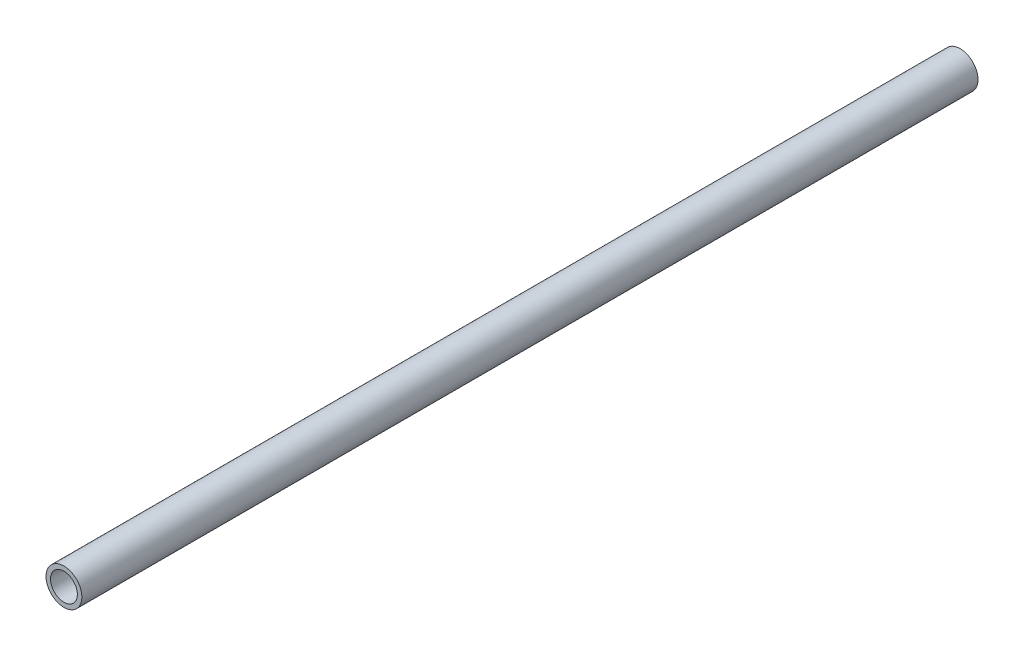
ISO-10303-21;
HEADER;
FILE_DESCRIPTION(('STEP AP214'),'2;1');
FILE_NAME('part.step','',(''),(''),'','','');
FILE_SCHEMA(('AUTOMOTIVE_DESIGN { 1 0 10303 214 1 1 1 1 }'));
ENDSEC;
DATA;
#1=APPLICATION_CONTEXT('core data for automotive mechanical design processes');
#2=APPLICATION_PROTOCOL_DEFINITION('international standard','automotive_design',2000,#1);
#3=PRODUCT_CONTEXT('',#1,'mechanical');
#4=PRODUCT('Part','Part','',(#3));
#5=PRODUCT_RELATED_PRODUCT_CATEGORY('part','',(#4));
#6=PRODUCT_DEFINITION_FORMATION('','',#4);
#7=PRODUCT_DEFINITION_CONTEXT('part definition',#1,'design');
#8=PRODUCT_DEFINITION('design','',#6,#7);
#9=PRODUCT_DEFINITION_SHAPE('','',#8);
#10=(LENGTH_UNIT() NAMED_UNIT(*) SI_UNIT(.MILLI.,.METRE.));
#11=(NAMED_UNIT(*) PLANE_ANGLE_UNIT() SI_UNIT($,.RADIAN.));
#12=(NAMED_UNIT(*) SI_UNIT($,.STERADIAN.) SOLID_ANGLE_UNIT());
#13=UNCERTAINTY_MEASURE_WITH_UNIT(LENGTH_MEASURE(1.E-05),#10,'distance_accuracy_value','');
#14=(GEOMETRIC_REPRESENTATION_CONTEXT(3) GLOBAL_UNCERTAINTY_ASSIGNED_CONTEXT((#13)) GLOBAL_UNIT_ASSIGNED_CONTEXT((#10,
#11,#12)) REPRESENTATION_CONTEXT('',''));
#15=CARTESIAN_POINT('',(0.,0.,0.));
#16=DIRECTION('',(0.,0.,1.));
#17=DIRECTION('',(1.,0.,0.));
#18=AXIS2_PLACEMENT_3D('',#15,#16,#17);
#19=CARTESIAN_POINT('',(0.,0.,635.));
#20=DIRECTION('',(0.,0.,1.));
#21=DIRECTION('',(1.,0.,0.));
#22=AXIS2_PLACEMENT_3D('',#19,#20,#21);
#23=PLANE('',#22);
#24=CARTESIAN_POINT('',(0.,0.,635.));
#25=DIRECTION('',(0.,0.,1.));
#26=DIRECTION('',(1.,0.,0.));
#27=AXIS2_PLACEMENT_3D('',#24,#25,#26);
#28=CIRCLE('',#27,12.7);
#29=CARTESIAN_POINT('',(-12.7,0.,635.));
#30=VERTEX_POINT('',#29);
#31=EDGE_CURVE('E10',#30,#30,#28,.T.);
#32=ORIENTED_EDGE('',*,*,#31,.T.);
#33=EDGE_LOOP('',(#32));
#34=FACE_BOUND('',#33,.T.);
#35=CARTESIAN_POINT('',(0.,0.,635.));
#36=DIRECTION('',(0.,0.,1.));
#37=DIRECTION('',(1.,0.,0.));
#38=AXIS2_PLACEMENT_3D('',#35,#36,#37);
#39=CIRCLE('',#38,9.525);
#40=CARTESIAN_POINT('',(-9.525,0.,635.));
#41=VERTEX_POINT('',#40);
#42=EDGE_CURVE('E50',#41,#41,#39,.T.);
#43=ORIENTED_EDGE('',*,*,#42,.F.);
#44=EDGE_LOOP('',(#43));
#45=FACE_BOUND('',#44,.T.);
#46=ADVANCED_FACE('F37',(#34,#45),#23,.T.);
#47=CARTESIAN_POINT('',(0.,0.,0.));
#48=DIRECTION('',(0.,0.,1.));
#49=DIRECTION('',(1.,0.,0.));
#50=AXIS2_PLACEMENT_3D('',#47,#48,#49);
#51=PLANE('',#50);
#52=CARTESIAN_POINT('',(0.,0.,0.));
#53=DIRECTION('',(0.,0.,1.));
#54=DIRECTION('',(1.,0.,0.));
#55=AXIS2_PLACEMENT_3D('',#52,#53,#54);
#56=CIRCLE('',#55,12.7);
#57=CARTESIAN_POINT('',(-12.7,0.,-1.11022302462516E-13));
#58=VERTEX_POINT('',#57);
#59=EDGE_CURVE('E41',#58,#58,#56,.T.);
#60=ORIENTED_EDGE('',*,*,#59,.F.);
#61=EDGE_LOOP('',(#60));
#62=FACE_BOUND('',#61,.T.);
#63=CARTESIAN_POINT('',(0.,0.,0.));
#64=DIRECTION('',(0.,0.,1.));
#65=DIRECTION('',(1.,0.,0.));
#66=AXIS2_PLACEMENT_3D('',#63,#64,#65);
#67=CIRCLE('',#66,9.525);
#68=CARTESIAN_POINT('',(-9.525,0.,-1.11022302462516E-13));
#69=VERTEX_POINT('',#68);
#70=EDGE_CURVE('E52',#69,#69,#67,.T.);
#71=ORIENTED_EDGE('',*,*,#70,.T.);
#72=EDGE_LOOP('',(#71));
#73=FACE_BOUND('',#72,.T.);
#74=ADVANCED_FACE('F64',(#62,#73),#51,.F.);
#75=CARTESIAN_POINT('',(0.,0.,635.));
#76=DIRECTION('',(0.,0.,-1.));
#77=DIRECTION('',(-1.,0.,0.));
#78=AXIS2_PLACEMENT_3D('',#75,#76,#77);
#79=CYLINDRICAL_SURFACE('',#78,12.7);
#80=CARTESIAN_POINT('',(-12.7,0.,635.));
#81=CARTESIAN_POINT('',(-12.7,0.,628.385416666667));
#82=CARTESIAN_POINT('',(-12.7,0.,621.770833333333));
#83=CARTESIAN_POINT('',(-12.7,0.,608.541666666667));
#84=CARTESIAN_POINT('',(-12.7,0.,601.927083333333));
#85=CARTESIAN_POINT('',(-12.7,0.,588.697916666667));
#86=CARTESIAN_POINT('',(-12.7,0.,582.083333333333));
#87=CARTESIAN_POINT('',(-12.7,0.,568.854166666667));
#88=CARTESIAN_POINT('',(-12.7,0.,562.239583333333));
#89=CARTESIAN_POINT('',(-12.7,0.,549.010416666667));
#90=CARTESIAN_POINT('',(-12.7,0.,542.395833333333));
#91=CARTESIAN_POINT('',(-12.7,0.,529.166666666667));
#92=CARTESIAN_POINT('',(-12.7,0.,522.552083333333));
#93=CARTESIAN_POINT('',(-12.7,0.,509.322916666667));
#94=CARTESIAN_POINT('',(-12.7,0.,502.708333333333));
#95=CARTESIAN_POINT('',(-12.7,0.,489.479166666667));
#96=CARTESIAN_POINT('',(-12.7,0.,482.864583333333));
#97=CARTESIAN_POINT('',(-12.7,0.,469.635416666667));
#98=CARTESIAN_POINT('',(-12.7,0.,463.020833333333));
#99=CARTESIAN_POINT('',(-12.7,0.,449.791666666667));
#100=CARTESIAN_POINT('',(-12.7,0.,443.177083333333));
#101=CARTESIAN_POINT('',(-12.7,0.,429.947916666667));
#102=CARTESIAN_POINT('',(-12.7,0.,423.333333333333));
#103=CARTESIAN_POINT('',(-12.7,0.,410.104166666667));
#104=CARTESIAN_POINT('',(-12.7,0.,403.489583333333));
#105=CARTESIAN_POINT('',(-12.7,0.,390.260416666667));
#106=CARTESIAN_POINT('',(-12.7,0.,383.645833333333));
#107=CARTESIAN_POINT('',(-12.7,0.,370.416666666667));
#108=CARTESIAN_POINT('',(-12.7,0.,363.802083333333));
#109=CARTESIAN_POINT('',(-12.7,0.,350.572916666667));
#110=CARTESIAN_POINT('',(-12.7,0.,343.958333333333));
#111=CARTESIAN_POINT('',(-12.7,0.,330.729166666667));
#112=CARTESIAN_POINT('',(-12.7,0.,324.114583333333));
#113=CARTESIAN_POINT('',(-12.7,0.,310.885416666667));
#114=CARTESIAN_POINT('',(-12.7,0.,304.270833333333));
#115=CARTESIAN_POINT('',(-12.7,0.,291.041666666667));
#116=CARTESIAN_POINT('',(-12.7,0.,284.427083333333));
#117=CARTESIAN_POINT('',(-12.7,0.,271.197916666667));
#118=CARTESIAN_POINT('',(-12.7,0.,264.583333333333));
#119=CARTESIAN_POINT('',(-12.7,0.,251.354166666667));
#120=CARTESIAN_POINT('',(-12.7,0.,244.739583333333));
#121=CARTESIAN_POINT('',(-12.7,0.,231.510416666667));
#122=CARTESIAN_POINT('',(-12.7,0.,224.895833333333));
#123=CARTESIAN_POINT('',(-12.7,0.,211.666666666667));
#124=CARTESIAN_POINT('',(-12.7,0.,205.052083333333));
#125=CARTESIAN_POINT('',(-12.7,0.,191.822916666667));
#126=CARTESIAN_POINT('',(-12.7,0.,185.208333333333));
#127=CARTESIAN_POINT('',(-12.7,0.,171.979166666667));
#128=CARTESIAN_POINT('',(-12.7,0.,165.364583333333));
#129=CARTESIAN_POINT('',(-12.7,0.,152.135416666667));
#130=CARTESIAN_POINT('',(-12.7,0.,145.520833333333));
#131=CARTESIAN_POINT('',(-12.7,0.,132.291666666667));
#132=CARTESIAN_POINT('',(-12.7,0.,125.677083333333));
#133=CARTESIAN_POINT('',(-12.7,0.,112.447916666667));
#134=CARTESIAN_POINT('',(-12.7,0.,105.833333333333));
#135=CARTESIAN_POINT('',(-12.7,0.,92.6041666666666));
#136=CARTESIAN_POINT('',(-12.7,0.,85.9895833333332));
#137=CARTESIAN_POINT('',(-12.7,0.,72.7604166666665));
#138=CARTESIAN_POINT('',(-12.7,0.,66.1458333333332));
#139=CARTESIAN_POINT('',(-12.7,0.,52.9166666666666));
#140=CARTESIAN_POINT('',(-12.7,0.,46.3020833333332));
#141=CARTESIAN_POINT('',(-12.7,0.,33.0729166666666));
#142=CARTESIAN_POINT('',(-12.7,0.,26.4583333333333));
#143=CARTESIAN_POINT('',(-12.7,0.,13.2291666666666));
#144=CARTESIAN_POINT('',(-12.7,0.,6.61458333333324));
#145=CARTESIAN_POINT('',(-12.7,0.,-1.11022302462516E-13));
#146=B_SPLINE_CURVE_WITH_KNOTS('',3,(#80,#81,#82,#83,#84,#85,#86,#87,#88,#89,#90,#91,#92,#93,
#94,#95,#96,#97,#98,#99,#100,#101,#102,#103,#104,#105,#106,#107,#108,#109,#110,#111,#112,#113,
#114,#115,#116,#117,#118,#119,#120,#121,#122,#123,#124,#125,#126,#127,#128,#129,#130,#131,#132,
#133,#134,#135,#136,#137,#138,#139,#140,#141,#142,#143,#144,#145),.UNSPECIFIED.,.F.,.F.,(4,2,2,
2,2,2,2,2,2,2,2,2,2,2,2,2,2,2,2,2,2,2,2,2,2,2,2,2,2,2,2,2,4),(0.,19.8437499999999,39.6875,
59.5312499999999,79.375,99.2187499999999,119.0625,138.90625,158.75,178.59375,198.4375,218.28125,
238.125,257.96875,277.8125,297.65625,317.5,337.34375,357.1875,377.03125,396.875,416.71875,
436.5625,456.40625,476.25,496.09375,515.9375,535.78125,555.625,575.46875,595.3125,615.15625,
635.),.UNSPECIFIED.);
#147=EDGE_CURVE('BSEAM39',#30,#58,#146,.T.);
#148=ORIENTED_EDGE('',*,*,#31,.F.);
#149=ORIENTED_EDGE('',*,*,#59,.T.);
#150=ORIENTED_EDGE('',*,*,#147,.T.);
#151=ORIENTED_EDGE('',*,*,#147,.F.);
#152=EDGE_LOOP('',(#148,#150,#149,#151));
#153=FACE_BOUND('',#152,.T.);
#154=ADVANCED_FACE('F39',(#153),#79,.T.);
#155=CARTESIAN_POINT('',(0.,0.,635.));
#156=DIRECTION('',(0.,0.,-1.));
#157=DIRECTION('',(-1.,0.,0.));
#158=AXIS2_PLACEMENT_3D('',#155,#156,#157);
#159=CYLINDRICAL_SURFACE('',#158,9.525);
#160=CARTESIAN_POINT('',(-9.525,0.,635.));
#161=CARTESIAN_POINT('',(-9.525,0.,628.385416666667));
#162=CARTESIAN_POINT('',(-9.525,0.,621.770833333333));
#163=CARTESIAN_POINT('',(-9.525,0.,608.541666666667));
#164=CARTESIAN_POINT('',(-9.525,0.,601.927083333333));
#165=CARTESIAN_POINT('',(-9.525,0.,588.697916666667));
#166=CARTESIAN_POINT('',(-9.525,0.,582.083333333333));
#167=CARTESIAN_POINT('',(-9.525,0.,568.854166666667));
#168=CARTESIAN_POINT('',(-9.525,0.,562.239583333333));
#169=CARTESIAN_POINT('',(-9.525,0.,549.010416666667));
#170=CARTESIAN_POINT('',(-9.525,0.,542.395833333333));
#171=CARTESIAN_POINT('',(-9.525,0.,529.166666666667));
#172=CARTESIAN_POINT('',(-9.525,0.,522.552083333333));
#173=CARTESIAN_POINT('',(-9.525,0.,509.322916666667));
#174=CARTESIAN_POINT('',(-9.525,0.,502.708333333333));
#175=CARTESIAN_POINT('',(-9.525,0.,489.479166666667));
#176=CARTESIAN_POINT('',(-9.525,0.,482.864583333333));
#177=CARTESIAN_POINT('',(-9.525,0.,469.635416666667));
#178=CARTESIAN_POINT('',(-9.525,0.,463.020833333333));
#179=CARTESIAN_POINT('',(-9.525,0.,449.791666666667));
#180=CARTESIAN_POINT('',(-9.525,0.,443.177083333333));
#181=CARTESIAN_POINT('',(-9.525,0.,429.947916666667));
#182=CARTESIAN_POINT('',(-9.525,0.,423.333333333333));
#183=CARTESIAN_POINT('',(-9.525,0.,410.104166666667));
#184=CARTESIAN_POINT('',(-9.525,0.,403.489583333333));
#185=CARTESIAN_POINT('',(-9.525,0.,390.260416666667));
#186=CARTESIAN_POINT('',(-9.525,0.,383.645833333333));
#187=CARTESIAN_POINT('',(-9.525,0.,370.416666666667));
#188=CARTESIAN_POINT('',(-9.525,0.,363.802083333333));
#189=CARTESIAN_POINT('',(-9.525,0.,350.572916666667));
#190=CARTESIAN_POINT('',(-9.525,0.,343.958333333333));
#191=CARTESIAN_POINT('',(-9.525,0.,330.729166666667));
#192=CARTESIAN_POINT('',(-9.525,0.,324.114583333333));
#193=CARTESIAN_POINT('',(-9.525,0.,310.885416666667));
#194=CARTESIAN_POINT('',(-9.525,0.,304.270833333333));
#195=CARTESIAN_POINT('',(-9.525,0.,291.041666666667));
#196=CARTESIAN_POINT('',(-9.525,0.,284.427083333333));
#197=CARTESIAN_POINT('',(-9.525,0.,271.197916666667));
#198=CARTESIAN_POINT('',(-9.525,0.,264.583333333333));
#199=CARTESIAN_POINT('',(-9.525,0.,251.354166666667));
#200=CARTESIAN_POINT('',(-9.525,0.,244.739583333333));
#201=CARTESIAN_POINT('',(-9.525,0.,231.510416666667));
#202=CARTESIAN_POINT('',(-9.525,0.,224.895833333333));
#203=CARTESIAN_POINT('',(-9.525,0.,211.666666666667));
#204=CARTESIAN_POINT('',(-9.525,0.,205.052083333333));
#205=CARTESIAN_POINT('',(-9.525,0.,191.822916666666));
#206=CARTESIAN_POINT('',(-9.525,0.,185.208333333333));
#207=CARTESIAN_POINT('',(-9.525,0.,171.979166666666));
#208=CARTESIAN_POINT('',(-9.525,0.,165.364583333333));
#209=CARTESIAN_POINT('',(-9.525,0.,152.135416666666));
#210=CARTESIAN_POINT('',(-9.525,0.,145.520833333333));
#211=CARTESIAN_POINT('',(-9.525,0.,132.291666666667));
#212=CARTESIAN_POINT('',(-9.525,0.,125.677083333333));
#213=CARTESIAN_POINT('',(-9.525,0.,112.447916666667));
#214=CARTESIAN_POINT('',(-9.525,0.,105.833333333333));
#215=CARTESIAN_POINT('',(-9.525,0.,92.6041666666666));
#216=CARTESIAN_POINT('',(-9.525,0.,85.9895833333332));
#217=CARTESIAN_POINT('',(-9.525,0.,72.7604166666665));
#218=CARTESIAN_POINT('',(-9.525,0.,66.1458333333332));
#219=CARTESIAN_POINT('',(-9.525,0.,52.9166666666666));
#220=CARTESIAN_POINT('',(-9.525,0.,46.3020833333332));
#221=CARTESIAN_POINT('',(-9.525,0.,33.0729166666666));
#222=CARTESIAN_POINT('',(-9.525,0.,26.4583333333333));
#223=CARTESIAN_POINT('',(-9.525,0.,13.2291666666666));
#224=CARTESIAN_POINT('',(-9.525,0.,6.61458333333324));
#225=CARTESIAN_POINT('',(-9.525,0.,-1.11022302462516E-13));
#226=B_SPLINE_CURVE_WITH_KNOTS('',3,(#160,#161,#162,#163,#164,#165,#166,#167,#168,#169,#170,
#171,#172,#173,#174,#175,#176,#177,#178,#179,#180,#181,#182,#183,#184,#185,#186,#187,#188,#189,
#190,#191,#192,#193,#194,#195,#196,#197,#198,#199,#200,#201,#202,#203,#204,#205,#206,#207,#208,
#209,#210,#211,#212,#213,#214,#215,#216,#217,#218,#219,#220,#221,#222,#223,#224,#225),
.UNSPECIFIED.,.F.,.F.,(4,2,2,2,2,2,2,2,2,2,2,2,2,2,2,2,2,2,2,2,2,2,2,2,2,2,2,2,2,2,2,2,4),(0.,
19.84375,39.6875000000001,59.53125,79.3750000000001,99.2187500000001,119.0625,138.90625,158.75,
178.59375,198.4375,218.28125,238.125,257.96875,277.8125,297.65625,317.5,337.34375,357.1875,
377.03125,396.875,416.71875,436.5625,456.40625,476.25,496.09375,515.9375,535.78125,555.625,
575.46875,595.3125,615.15625,635.),.UNSPECIFIED.);
#227=EDGE_CURVE('BSEAM60',#41,#69,#226,.T.);
#228=ORIENTED_EDGE('',*,*,#42,.T.);
#229=ORIENTED_EDGE('',*,*,#70,.F.);
#230=ORIENTED_EDGE('',*,*,#227,.T.);
#231=ORIENTED_EDGE('',*,*,#227,.F.);
#232=EDGE_LOOP('',(#228,#230,#229,#231));
#233=FACE_BOUND('',#232,.T.);
#234=ADVANCED_FACE('F60',(#233),#159,.F.);
#235=CLOSED_SHELL('',(#46,#74,#154,#234));
#236=MANIFOLD_SOLID_BREP('B2',#235);
#237=ADVANCED_BREP_SHAPE_REPRESENTATION('',(#18,#236),#14);
#238=SHAPE_DEFINITION_REPRESENTATION(#9,#237);
ENDSEC;
END-ISO-10303-21;
